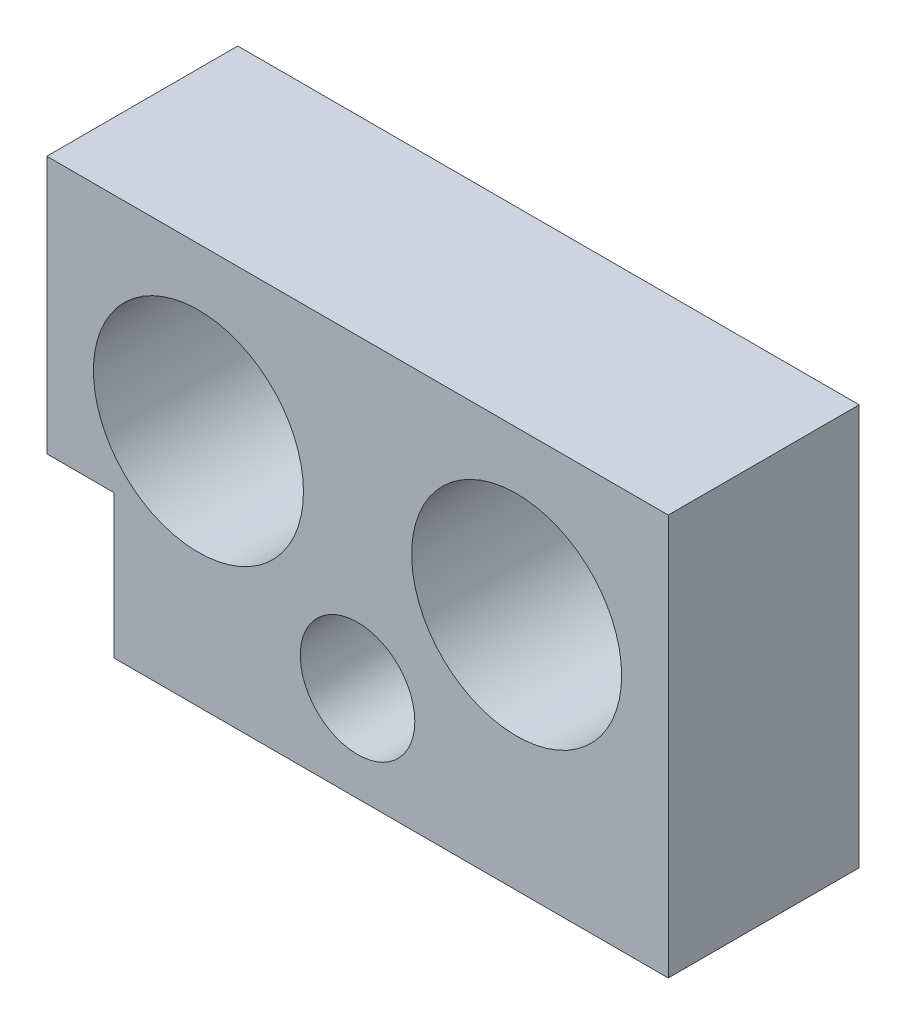
ISO-10303-21;
HEADER;
FILE_DESCRIPTION(('STEP AP214'),'2;1');
FILE_NAME('part.step','',(''),(''),'','','');
FILE_SCHEMA(('AUTOMOTIVE_DESIGN { 1 0 10303 214 1 1 1 1 }'));
ENDSEC;
DATA;
#1=APPLICATION_CONTEXT('core data for automotive mechanical design processes');
#2=APPLICATION_PROTOCOL_DEFINITION('international standard','automotive_design',2000,#1);
#3=PRODUCT_CONTEXT('',#1,'mechanical');
#4=PRODUCT('Part','Part','',(#3));
#5=PRODUCT_RELATED_PRODUCT_CATEGORY('part','',(#4));
#6=PRODUCT_DEFINITION_FORMATION('','',#4);
#7=PRODUCT_DEFINITION_CONTEXT('part definition',#1,'design');
#8=PRODUCT_DEFINITION('design','',#6,#7);
#9=PRODUCT_DEFINITION_SHAPE('','',#8);
#10=(LENGTH_UNIT() NAMED_UNIT(*) SI_UNIT(.MILLI.,.METRE.));
#11=(NAMED_UNIT(*) PLANE_ANGLE_UNIT() SI_UNIT($,.RADIAN.));
#12=(NAMED_UNIT(*) SI_UNIT($,.STERADIAN.) SOLID_ANGLE_UNIT());
#13=UNCERTAINTY_MEASURE_WITH_UNIT(LENGTH_MEASURE(1.E-05),#10,'distance_accuracy_value','');
#14=(GEOMETRIC_REPRESENTATION_CONTEXT(3) GLOBAL_UNCERTAINTY_ASSIGNED_CONTEXT((#13)) GLOBAL_UNIT_ASSIGNED_CONTEXT((#10,
#11,#12)) REPRESENTATION_CONTEXT('',''));
#15=CARTESIAN_POINT('',(0.,0.,0.));
#16=DIRECTION('',(0.,0.,1.));
#17=DIRECTION('',(1.,0.,0.));
#18=AXIS2_PLACEMENT_3D('',#15,#16,#17);
#19=CARTESIAN_POINT('',(32.55,17.,20.));
#20=DIRECTION('',(-1.,0.,0.));
#21=DIRECTION('',(0.,-1.,0.));
#22=AXIS2_PLACEMENT_3D('',#19,#20,#21);
#23=PLANE('',#22);
#24=DIRECTION('',(0.,1.,0.));
#25=VECTOR('',#24,1.);
#26=CARTESIAN_POINT('',(32.55,17.,0.));
#27=LINE('',#26,#25);
#28=CARTESIAN_POINT('',(32.55,-25.,0.));
#29=VERTEX_POINT('',#28);
#30=CARTESIAN_POINT('',(32.55,17.,0.));
#31=VERTEX_POINT('',#30);
#32=EDGE_CURVE('E113',#29,#31,#27,.T.);
#33=ORIENTED_EDGE('',*,*,#32,.T.);
#34=DIRECTION('',(0.,0.,-1.));
#35=VECTOR('',#34,1.);
#36=CARTESIAN_POINT('',(32.55,17.,20.));
#37=LINE('',#36,#35);
#38=CARTESIAN_POINT('',(32.55,17.,20.));
#39=VERTEX_POINT('',#38);
#40=EDGE_CURVE('E41',#39,#31,#37,.T.);
#41=ORIENTED_EDGE('',*,*,#40,.F.);
#42=DIRECTION('',(0.,1.,0.));
#43=VECTOR('',#42,1.);
#44=CARTESIAN_POINT('',(32.55,17.,20.));
#45=LINE('',#44,#43);
#46=CARTESIAN_POINT('',(32.55,-25.,20.));
#47=VERTEX_POINT('',#46);
#48=EDGE_CURVE('E116',#47,#39,#45,.T.);
#49=ORIENTED_EDGE('',*,*,#48,.F.);
#50=DIRECTION('',(0.,0.,-1.));
#51=VECTOR('',#50,1.);
#52=CARTESIAN_POINT('',(32.55,-25.,20.));
#53=LINE('',#52,#51);
#54=EDGE_CURVE('E11',#47,#29,#53,.T.);
#55=ORIENTED_EDGE('',*,*,#54,.T.);
#56=EDGE_LOOP('',(#33,#41,#49,#55));
#57=FACE_BOUND('',#56,.T.);
#58=ADVANCED_FACE('F34',(#57),#23,.F.);
#59=CARTESIAN_POINT('',(-32.55,17.,20.));
#60=DIRECTION('',(0.,-1.,0.));
#61=DIRECTION('',(0.,0.,-1.));
#62=AXIS2_PLACEMENT_3D('',#59,#60,#61);
#63=PLANE('',#62);
#64=DIRECTION('',(-1.,0.,0.));
#65=VECTOR('',#64,1.);
#66=CARTESIAN_POINT('',(-32.55,17.,0.));
#67=LINE('',#66,#65);
#68=CARTESIAN_POINT('',(-32.55,17.,0.));
#69=VERTEX_POINT('',#68);
#70=EDGE_CURVE('E74',#31,#69,#67,.T.);
#71=ORIENTED_EDGE('',*,*,#70,.T.);
#72=DIRECTION('',(0.,0.,-1.));
#73=VECTOR('',#72,1.);
#74=CARTESIAN_POINT('',(-32.55,17.,20.));
#75=LINE('',#74,#73);
#76=CARTESIAN_POINT('',(-32.55,17.,20.));
#77=VERTEX_POINT('',#76);
#78=EDGE_CURVE('E122',#77,#69,#75,.T.);
#79=ORIENTED_EDGE('',*,*,#78,.F.);
#80=DIRECTION('',(-1.,0.,0.));
#81=VECTOR('',#80,1.);
#82=CARTESIAN_POINT('',(-32.55,17.,20.));
#83=LINE('',#82,#81);
#84=EDGE_CURVE('E57',#39,#77,#83,.T.);
#85=ORIENTED_EDGE('',*,*,#84,.F.);
#86=ORIENTED_EDGE('',*,*,#40,.T.);
#87=EDGE_LOOP('',(#71,#79,#85,#86));
#88=FACE_BOUND('',#87,.T.);
#89=ADVANCED_FACE('F125',(#88),#63,.F.);
#90=CARTESIAN_POINT('',(-32.55,-25.,20.));
#91=DIRECTION('',(1.,0.,0.));
#92=DIRECTION('',(0.,1.,0.));
#93=AXIS2_PLACEMENT_3D('',#90,#91,#92);
#94=PLANE('',#93);
#95=DIRECTION('',(0.,-1.,0.));
#96=VECTOR('',#95,1.);
#97=CARTESIAN_POINT('',(-32.55,-25.,0.));
#98=LINE('',#97,#96);
#99=CARTESIAN_POINT('',(-32.55,-10.,0.));
#100=VERTEX_POINT('',#99);
#101=EDGE_CURVE('E114',#69,#100,#98,.T.);
#102=ORIENTED_EDGE('',*,*,#101,.T.);
#103=DIRECTION('',(0.,0.,1.));
#104=VECTOR('',#103,1.);
#105=CARTESIAN_POINT('',(-32.55,-10.,0.));
#106=LINE('',#105,#104);
#107=CARTESIAN_POINT('',(-32.55,-10.,20.));
#108=VERTEX_POINT('',#107);
#109=EDGE_CURVE('E149',#100,#108,#106,.T.);
#110=ORIENTED_EDGE('',*,*,#109,.T.);
#111=DIRECTION('',(0.,-1.,0.));
#112=VECTOR('',#111,1.);
#113=CARTESIAN_POINT('',(-32.55,-25.,20.));
#114=LINE('',#113,#112);
#115=EDGE_CURVE('E123',#77,#108,#114,.T.);
#116=ORIENTED_EDGE('',*,*,#115,.F.);
#117=ORIENTED_EDGE('',*,*,#78,.T.);
#118=EDGE_LOOP('',(#102,#110,#116,#117));
#119=FACE_BOUND('',#118,.T.);
#120=ADVANCED_FACE('F159',(#119),#94,.F.);
#121=CARTESIAN_POINT('',(-30.55,-25.,20.));
#122=DIRECTION('',(0.,1.,0.));
#123=DIRECTION('',(-1.,0.,0.));
#124=AXIS2_PLACEMENT_3D('',#121,#122,#123);
#125=PLANE('',#124);
#126=DIRECTION('',(1.,0.,0.));
#127=VECTOR('',#126,1.);
#128=CARTESIAN_POINT('',(32.55,-25.,20.));
#129=LINE('',#128,#127);
#130=CARTESIAN_POINT('',(-25.5,-25.,20.));
#131=VERTEX_POINT('',#130);
#132=EDGE_CURVE('E79',#131,#47,#129,.T.);
#133=ORIENTED_EDGE('',*,*,#132,.F.);
#134=DIRECTION('',(0.,0.,1.));
#135=VECTOR('',#134,1.);
#136=CARTESIAN_POINT('',(-25.5,-25.,0.));
#137=LINE('',#136,#135);
#138=CARTESIAN_POINT('',(-25.5,-25.,0.));
#139=VERTEX_POINT('',#138);
#140=EDGE_CURVE('E99',#139,#131,#137,.T.);
#141=ORIENTED_EDGE('',*,*,#140,.F.);
#142=DIRECTION('',(1.,0.,0.));
#143=VECTOR('',#142,1.);
#144=CARTESIAN_POINT('',(-30.55,-25.,0.));
#145=LINE('',#144,#143);
#146=EDGE_CURVE('E108',#139,#29,#145,.T.);
#147=ORIENTED_EDGE('',*,*,#146,.T.);
#148=ORIENTED_EDGE('',*,*,#54,.F.);
#149=EDGE_LOOP('',(#133,#141,#147,#148));
#150=FACE_BOUND('',#149,.T.);
#151=ADVANCED_FACE('F106',(#150),#125,.F.);
#152=CARTESIAN_POINT('',(0.,0.,20.));
#153=DIRECTION('',(0.,0.,-1.));
#154=DIRECTION('',(-1.,0.,0.));
#155=AXIS2_PLACEMENT_3D('',#152,#153,#154);
#156=PLANE('',#155);
#157=CARTESIAN_POINT('',(16.665,0.,20.));
#158=DIRECTION('',(0.,0.,1.));
#159=DIRECTION('',(1.,0.,0.));
#160=AXIS2_PLACEMENT_3D('',#157,#158,#159);
#161=CIRCLE('',#160,11.);
#162=CARTESIAN_POINT('',(27.665,0.,20.));
#163=VERTEX_POINT('',#162);
#164=EDGE_CURVE('E140',#163,#163,#161,.T.);
#165=ORIENTED_EDGE('',*,*,#164,.F.);
#166=EDGE_LOOP('',(#165));
#167=FACE_BOUND('',#166,.T.);
#168=CARTESIAN_POINT('',(0.,-15.,20.));
#169=DIRECTION('',(0.,0.,1.));
#170=DIRECTION('',(1.,0.,0.));
#171=AXIS2_PLACEMENT_3D('',#168,#169,#170);
#172=CIRCLE('',#171,6.);
#173=CARTESIAN_POINT('',(6.,-15.,20.));
#174=VERTEX_POINT('',#173);
#175=EDGE_CURVE('E146',#174,#174,#172,.T.);
#176=ORIENTED_EDGE('',*,*,#175,.F.);
#177=EDGE_LOOP('',(#176));
#178=FACE_BOUND('',#177,.T.);
#179=CARTESIAN_POINT('',(-16.665,0.,20.));
#180=DIRECTION('',(0.,0.,1.));
#181=DIRECTION('',(1.,0.,0.));
#182=AXIS2_PLACEMENT_3D('',#179,#180,#181);
#183=CIRCLE('',#182,11.);
#184=CARTESIAN_POINT('',(-5.66500000000001,0.,20.));
#185=VERTEX_POINT('',#184);
#186=EDGE_CURVE('E134',#185,#185,#183,.T.);
#187=ORIENTED_EDGE('',*,*,#186,.F.);
#188=EDGE_LOOP('',(#187));
#189=FACE_BOUND('',#188,.T.);
#190=ORIENTED_EDGE('',*,*,#115,.T.);
#191=DIRECTION('',(-1.,0.,0.));
#192=VECTOR('',#191,1.);
#193=CARTESIAN_POINT('',(-32.55,-10.,20.));
#194=LINE('',#193,#192);
#195=CARTESIAN_POINT('',(-25.5,-10.,20.));
#196=VERTEX_POINT('',#195);
#197=EDGE_CURVE('E103',#196,#108,#194,.T.);
#198=ORIENTED_EDGE('',*,*,#197,.F.);
#199=DIRECTION('',(0.,1.,0.));
#200=VECTOR('',#199,1.);
#201=CARTESIAN_POINT('',(-25.5,-25.,20.));
#202=LINE('',#201,#200);
#203=EDGE_CURVE('E156',#131,#196,#202,.T.);
#204=ORIENTED_EDGE('',*,*,#203,.F.);
#205=ORIENTED_EDGE('',*,*,#132,.T.);
#206=ORIENTED_EDGE('',*,*,#48,.T.);
#207=ORIENTED_EDGE('',*,*,#84,.T.);
#208=EDGE_LOOP('',(#190,#198,#204,#205,#206,#207));
#209=FACE_BOUND('',#208,.T.);
#210=ADVANCED_FACE('F162',(#167,#178,#189,#209),#156,.F.);
#211=CARTESIAN_POINT('',(0.,0.,0.));
#212=DIRECTION('',(0.,0.,-1.));
#213=DIRECTION('',(-1.,0.,0.));
#214=AXIS2_PLACEMENT_3D('',#211,#212,#213);
#215=PLANE('',#214);
#216=DIRECTION('',(-1.,0.,0.));
#217=VECTOR('',#216,1.);
#218=CARTESIAN_POINT('',(-32.55,-10.,0.));
#219=LINE('',#218,#217);
#220=CARTESIAN_POINT('',(-25.5,-10.,0.));
#221=VERTEX_POINT('',#220);
#222=EDGE_CURVE('E48',#221,#100,#219,.T.);
#223=ORIENTED_EDGE('',*,*,#222,.T.);
#224=ORIENTED_EDGE('',*,*,#101,.F.);
#225=ORIENTED_EDGE('',*,*,#70,.F.);
#226=ORIENTED_EDGE('',*,*,#32,.F.);
#227=ORIENTED_EDGE('',*,*,#146,.F.);
#228=DIRECTION('',(0.,1.,0.));
#229=VECTOR('',#228,1.);
#230=CARTESIAN_POINT('',(-25.5,-25.,0.));
#231=LINE('',#230,#229);
#232=EDGE_CURVE('E95',#139,#221,#231,.T.);
#233=ORIENTED_EDGE('',*,*,#232,.T.);
#234=EDGE_LOOP('',(#223,#224,#225,#226,#227,#233));
#235=FACE_BOUND('',#234,.T.);
#236=CARTESIAN_POINT('',(16.665,0.,0.));
#237=DIRECTION('',(0.,0.,1.));
#238=DIRECTION('',(1.,0.,0.));
#239=AXIS2_PLACEMENT_3D('',#236,#237,#238);
#240=CIRCLE('',#239,11.);
#241=CARTESIAN_POINT('',(27.665,0.,0.));
#242=VERTEX_POINT('',#241);
#243=EDGE_CURVE('E137',#242,#242,#240,.T.);
#244=ORIENTED_EDGE('',*,*,#243,.T.);
#245=EDGE_LOOP('',(#244));
#246=FACE_BOUND('',#245,.T.);
#247=CARTESIAN_POINT('',(0.,-15.,0.));
#248=DIRECTION('',(0.,0.,1.));
#249=DIRECTION('',(1.,0.,0.));
#250=AXIS2_PLACEMENT_3D('',#247,#248,#249);
#251=CIRCLE('',#250,6.);
#252=CARTESIAN_POINT('',(6.,-15.,0.));
#253=VERTEX_POINT('',#252);
#254=EDGE_CURVE('E143',#253,#253,#251,.T.);
#255=ORIENTED_EDGE('',*,*,#254,.T.);
#256=EDGE_LOOP('',(#255));
#257=FACE_BOUND('',#256,.T.);
#258=CARTESIAN_POINT('',(-16.665,0.,0.));
#259=DIRECTION('',(0.,0.,1.));
#260=DIRECTION('',(1.,0.,0.));
#261=AXIS2_PLACEMENT_3D('',#258,#259,#260);
#262=CIRCLE('',#261,11.);
#263=CARTESIAN_POINT('',(-5.66500000000001,0.,0.));
#264=VERTEX_POINT('',#263);
#265=EDGE_CURVE('E128',#264,#264,#262,.T.);
#266=ORIENTED_EDGE('',*,*,#265,.T.);
#267=EDGE_LOOP('',(#266));
#268=FACE_BOUND('',#267,.T.);
#269=ADVANCED_FACE('F111',(#235,#246,#257,#268),#215,.T.);
#270=CARTESIAN_POINT('',(-16.665,0.,0.));
#271=DIRECTION('',(0.,0.,1.));
#272=DIRECTION('',(1.,0.,0.));
#273=AXIS2_PLACEMENT_3D('',#270,#271,#272);
#274=CYLINDRICAL_SURFACE('',#273,11.);
#275=ORIENTED_EDGE('',*,*,#265,.F.);
#276=EDGE_LOOP('',(#275));
#277=FACE_BOUND('',#276,.T.);
#278=ORIENTED_EDGE('',*,*,#186,.T.);
#279=EDGE_LOOP('',(#278));
#280=FACE_BOUND('',#279,.T.);
#281=ADVANCED_FACE('F188',(#277,#280),#274,.F.);
#282=CARTESIAN_POINT('',(0.,-15.,0.));
#283=DIRECTION('',(0.,0.,1.));
#284=DIRECTION('',(1.,0.,0.));
#285=AXIS2_PLACEMENT_3D('',#282,#283,#284);
#286=CYLINDRICAL_SURFACE('',#285,6.);
#287=ORIENTED_EDGE('',*,*,#254,.F.);
#288=EDGE_LOOP('',(#287));
#289=FACE_BOUND('',#288,.T.);
#290=ORIENTED_EDGE('',*,*,#175,.T.);
#291=EDGE_LOOP('',(#290));
#292=FACE_BOUND('',#291,.T.);
#293=ADVANCED_FACE('F172',(#289,#292),#286,.F.);
#294=CARTESIAN_POINT('',(16.665,0.,0.));
#295=DIRECTION('',(0.,0.,1.));
#296=DIRECTION('',(1.,0.,0.));
#297=AXIS2_PLACEMENT_3D('',#294,#295,#296);
#298=CYLINDRICAL_SURFACE('',#297,11.);
#299=ORIENTED_EDGE('',*,*,#243,.F.);
#300=EDGE_LOOP('',(#299));
#301=FACE_BOUND('',#300,.T.);
#302=ORIENTED_EDGE('',*,*,#164,.T.);
#303=EDGE_LOOP('',(#302));
#304=FACE_BOUND('',#303,.T.);
#305=ADVANCED_FACE('F165',(#301,#304),#298,.F.);
#306=CARTESIAN_POINT('',(-32.55,-10.,0.));
#307=DIRECTION('',(0.,1.,0.));
#308=DIRECTION('',(0.,0.,1.));
#309=AXIS2_PLACEMENT_3D('',#306,#307,#308);
#310=PLANE('',#309);
#311=ORIENTED_EDGE('',*,*,#197,.T.);
#312=ORIENTED_EDGE('',*,*,#109,.F.);
#313=ORIENTED_EDGE('',*,*,#222,.F.);
#314=DIRECTION('',(0.,0.,1.));
#315=VECTOR('',#314,1.);
#316=CARTESIAN_POINT('',(-25.5,-10.,0.));
#317=LINE('',#316,#315);
#318=EDGE_CURVE('E100',#221,#196,#317,.T.);
#319=ORIENTED_EDGE('',*,*,#318,.T.);
#320=EDGE_LOOP('',(#311,#312,#313,#319));
#321=FACE_BOUND('',#320,.T.);
#322=ADVANCED_FACE('F163',(#321),#310,.F.);
#323=CARTESIAN_POINT('',(-25.5,-25.,0.));
#324=DIRECTION('',(1.,0.,0.));
#325=DIRECTION('',(0.,0.,-1.));
#326=AXIS2_PLACEMENT_3D('',#323,#324,#325);
#327=PLANE('',#326);
#328=ORIENTED_EDGE('',*,*,#203,.T.);
#329=ORIENTED_EDGE('',*,*,#318,.F.);
#330=ORIENTED_EDGE('',*,*,#232,.F.);
#331=ORIENTED_EDGE('',*,*,#140,.T.);
#332=EDGE_LOOP('',(#328,#329,#330,#331));
#333=FACE_BOUND('',#332,.T.);
#334=ADVANCED_FACE('F98',(#333),#327,.F.);
#335=CLOSED_SHELL('',(#58,#89,#120,#151,#210,#269,#281,#293,#305,#322,#334));
#336=MANIFOLD_SOLID_BREP('B2',#335);
#337=ADVANCED_BREP_SHAPE_REPRESENTATION('',(#18,#336),#14);
#338=SHAPE_DEFINITION_REPRESENTATION(#9,#337);
ENDSEC;
END-ISO-10303-21;
